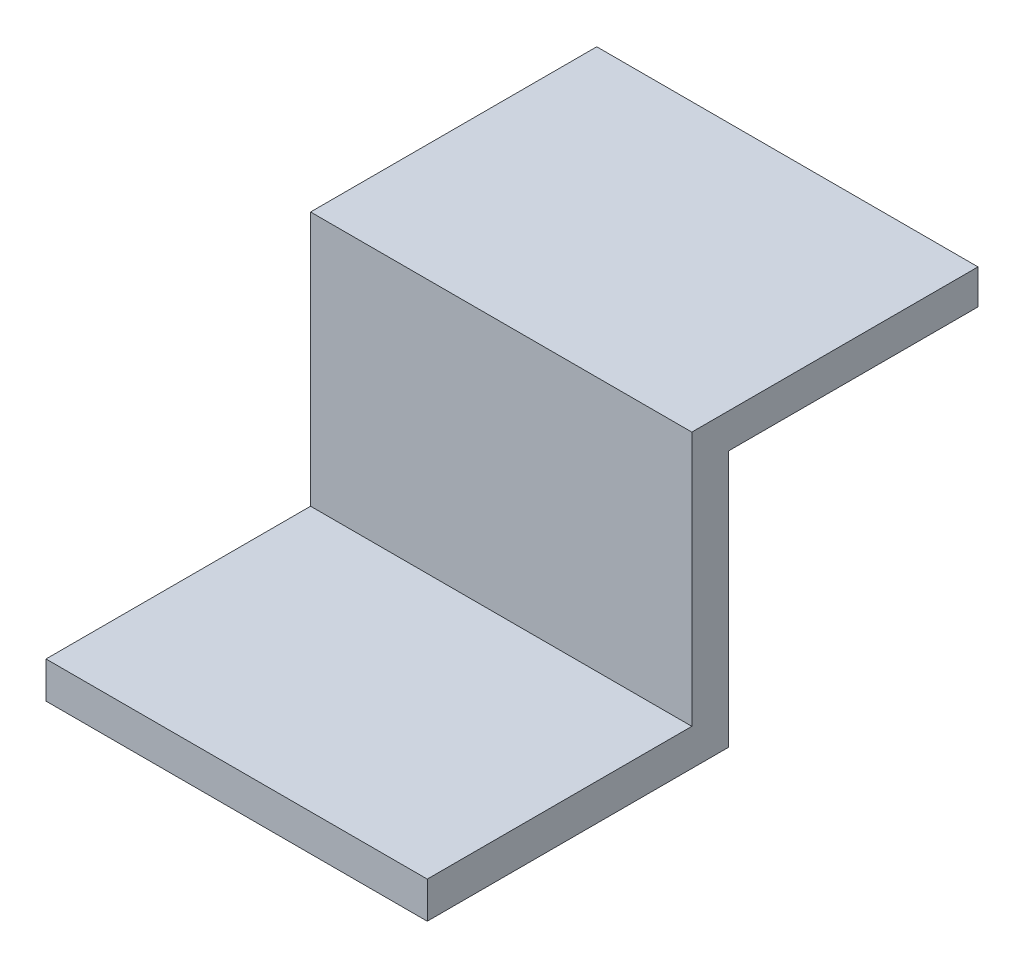
ISO-10303-21;
HEADER;
FILE_DESCRIPTION(('STEP AP214'),'2;1');
FILE_NAME('part.step','',(''),(''),'','','');
FILE_SCHEMA(('AUTOMOTIVE_DESIGN { 1 0 10303 214 1 1 1 1 }'));
ENDSEC;
DATA;
#1=APPLICATION_CONTEXT('core data for automotive mechanical design processes');
#2=APPLICATION_PROTOCOL_DEFINITION('international standard','automotive_design',2000,#1);
#3=PRODUCT_CONTEXT('',#1,'mechanical');
#4=PRODUCT('Part','Part','',(#3));
#5=PRODUCT_RELATED_PRODUCT_CATEGORY('part','',(#4));
#6=PRODUCT_DEFINITION_FORMATION('','',#4);
#7=PRODUCT_DEFINITION_CONTEXT('part definition',#1,'design');
#8=PRODUCT_DEFINITION('design','',#6,#7);
#9=PRODUCT_DEFINITION_SHAPE('','',#8);
#10=(LENGTH_UNIT() NAMED_UNIT(*) SI_UNIT(.MILLI.,.METRE.));
#11=(NAMED_UNIT(*) PLANE_ANGLE_UNIT() SI_UNIT($,.RADIAN.));
#12=(NAMED_UNIT(*) SI_UNIT($,.STERADIAN.) SOLID_ANGLE_UNIT());
#13=UNCERTAINTY_MEASURE_WITH_UNIT(LENGTH_MEASURE(1.E-05),#10,'distance_accuracy_value','');
#14=(GEOMETRIC_REPRESENTATION_CONTEXT(3) GLOBAL_UNCERTAINTY_ASSIGNED_CONTEXT((#13)) GLOBAL_UNIT_ASSIGNED_CONTEXT((#10,
#11,#12)) REPRESENTATION_CONTEXT('',''));
#15=CARTESIAN_POINT('',(0.,0.,0.));
#16=DIRECTION('',(0.,0.,1.));
#17=DIRECTION('',(1.,0.,0.));
#18=AXIS2_PLACEMENT_3D('',#15,#16,#17);
#19=CARTESIAN_POINT('',(-66.294,50.658753448874,-95.7628172012009));
#20=DIRECTION('',(0.,0.,-1.));
#21=DIRECTION('',(-1.,0.,0.));
#22=AXIS2_PLACEMENT_3D('',#19,#20,#21);
#23=PLANE('',#22);
#24=DIRECTION('',(0.,1.,0.));
#25=VECTOR('',#24,1.);
#26=CARTESIAN_POINT('',(0.,50.658753448874,-95.7628172012009));
#27=LINE('',#26,#25);
#28=CARTESIAN_POINT('',(0.,44.6271764040838,-95.7628172012009));
#29=VERTEX_POINT('',#28);
#30=CARTESIAN_POINT('',(0.,50.658753448874,-95.7628172012009));
#31=VERTEX_POINT('',#30);
#32=EDGE_CURVE('E141',#29,#31,#27,.T.);
#33=ORIENTED_EDGE('',*,*,#32,.F.);
#34=DIRECTION('',(1.,0.,0.));
#35=VECTOR('',#34,1.);
#36=CARTESIAN_POINT('',(-66.294,44.6271764040838,-95.7628172012009));
#37=LINE('',#36,#35);
#38=CARTESIAN_POINT('',(-66.294,44.6271764040838,-95.7628172012009));
#39=VERTEX_POINT('',#38);
#40=EDGE_CURVE('E40',#39,#29,#37,.T.);
#41=ORIENTED_EDGE('',*,*,#40,.F.);
#42=DIRECTION('',(0.,1.,0.));
#43=VECTOR('',#42,1.);
#44=CARTESIAN_POINT('',(-66.294,50.658753448874,-95.7628172012009));
#45=LINE('',#44,#43);
#46=CARTESIAN_POINT('',(-66.294,50.658753448874,-95.7628172012009));
#47=VERTEX_POINT('',#46);
#48=EDGE_CURVE('E115',#39,#47,#45,.T.);
#49=ORIENTED_EDGE('',*,*,#48,.T.);
#50=DIRECTION('',(1.,0.,0.));
#51=VECTOR('',#50,1.);
#52=CARTESIAN_POINT('',(-66.294,50.658753448874,-95.7628172012009));
#53=LINE('',#52,#51);
#54=EDGE_CURVE('E11',#47,#31,#53,.T.);
#55=ORIENTED_EDGE('',*,*,#54,.T.);
#56=EDGE_LOOP('',(#33,#41,#49,#55));
#57=FACE_BOUND('',#56,.T.);
#58=ADVANCED_FACE('F30',(#57),#23,.T.);
#59=CARTESIAN_POINT('',(-66.294,44.6271764040838,-52.3533001957925));
#60=DIRECTION('',(0.,-1.,0.));
#61=DIRECTION('',(0.,0.,-1.));
#62=AXIS2_PLACEMENT_3D('',#59,#60,#61);
#63=PLANE('',#62);
#64=DIRECTION('',(0.,0.,-1.));
#65=VECTOR('',#64,1.);
#66=CARTESIAN_POINT('',(0.,44.6271764040838,-52.3533001957925));
#67=LINE('',#66,#65);
#68=CARTESIAN_POINT('',(0.,44.6271764040838,-52.3533001957925));
#69=VERTEX_POINT('',#68);
#70=EDGE_CURVE('E101',#69,#29,#67,.T.);
#71=ORIENTED_EDGE('',*,*,#70,.F.);
#72=DIRECTION('',(1.,0.,0.));
#73=VECTOR('',#72,1.);
#74=CARTESIAN_POINT('',(-66.294,44.6271764040838,-52.3533001957925));
#75=LINE('',#74,#73);
#76=CARTESIAN_POINT('',(-66.294,44.6271764040838,-52.3533001957925));
#77=VERTEX_POINT('',#76);
#78=EDGE_CURVE('E96',#77,#69,#75,.T.);
#79=ORIENTED_EDGE('',*,*,#78,.F.);
#80=DIRECTION('',(0.,0.,-1.));
#81=VECTOR('',#80,1.);
#82=CARTESIAN_POINT('',(-66.294,44.6271764040838,-52.3533001957925));
#83=LINE('',#82,#81);
#84=EDGE_CURVE('E99',#77,#39,#83,.T.);
#85=ORIENTED_EDGE('',*,*,#84,.T.);
#86=ORIENTED_EDGE('',*,*,#40,.T.);
#87=EDGE_LOOP('',(#71,#79,#85,#86));
#88=FACE_BOUND('',#87,.T.);
#89=ADVANCED_FACE('F98',(#88),#63,.T.);
#90=CARTESIAN_POINT('',(-66.294,44.6271764040838,-52.3533001957925));
#91=DIRECTION('',(0.,0.,-1.));
#92=DIRECTION('',(0.,1.,0.));
#93=AXIS2_PLACEMENT_3D('',#90,#91,#92);
#94=PLANE('',#93);
#95=DIRECTION('',(0.,1.,0.));
#96=VECTOR('',#95,1.);
#97=CARTESIAN_POINT('',(0.,44.6271764040838,-52.3533001957925));
#98=LINE('',#97,#96);
#99=CARTESIAN_POINT('',(0.,0.,-52.3533001957925));
#100=VERTEX_POINT('',#99);
#101=EDGE_CURVE('E138',#100,#69,#98,.T.);
#102=ORIENTED_EDGE('',*,*,#101,.F.);
#103=DIRECTION('',(1.,0.,0.));
#104=VECTOR('',#103,1.);
#105=CARTESIAN_POINT('',(-66.294,0.,-52.3533001957925));
#106=LINE('',#105,#104);
#107=CARTESIAN_POINT('',(-66.294,0.,-52.3533001957925));
#108=VERTEX_POINT('',#107);
#109=EDGE_CURVE('E106',#108,#100,#106,.T.);
#110=ORIENTED_EDGE('',*,*,#109,.F.);
#111=DIRECTION('',(0.,1.,0.));
#112=VECTOR('',#111,1.);
#113=CARTESIAN_POINT('',(-66.294,44.6271764040838,-52.3533001957925));
#114=LINE('',#113,#112);
#115=EDGE_CURVE('E112',#108,#77,#114,.T.);
#116=ORIENTED_EDGE('',*,*,#115,.T.);
#117=ORIENTED_EDGE('',*,*,#78,.T.);
#118=EDGE_LOOP('',(#102,#110,#116,#117));
#119=FACE_BOUND('',#118,.T.);
#120=ADVANCED_FACE('F117',(#119),#94,.T.);
#121=CARTESIAN_POINT('',(-66.294,0.,-52.3533001957925));
#122=DIRECTION('',(0.,-1.,0.));
#123=DIRECTION('',(0.,0.,-1.));
#124=AXIS2_PLACEMENT_3D('',#121,#122,#123);
#125=PLANE('',#124);
#126=DIRECTION('',(0.,0.,-1.));
#127=VECTOR('',#126,1.);
#128=CARTESIAN_POINT('',(0.,0.,-52.3533001957925));
#129=LINE('',#128,#127);
#130=CARTESIAN_POINT('',(0.,0.,0.));
#131=VERTEX_POINT('',#130);
#132=EDGE_CURVE('E135',#131,#100,#129,.T.);
#133=ORIENTED_EDGE('',*,*,#132,.F.);
#134=DIRECTION('',(1.,0.,0.));
#135=VECTOR('',#134,1.);
#136=CARTESIAN_POINT('',(-66.294,0.,0.));
#137=LINE('',#136,#135);
#138=CARTESIAN_POINT('',(-66.294,0.,0.));
#139=VERTEX_POINT('',#138);
#140=EDGE_CURVE('E146',#139,#131,#137,.T.);
#141=ORIENTED_EDGE('',*,*,#140,.F.);
#142=DIRECTION('',(0.,0.,-1.));
#143=VECTOR('',#142,1.);
#144=CARTESIAN_POINT('',(-66.294,0.,-52.3533001957925));
#145=LINE('',#144,#143);
#146=EDGE_CURVE('E118',#139,#108,#145,.T.);
#147=ORIENTED_EDGE('',*,*,#146,.T.);
#148=ORIENTED_EDGE('',*,*,#109,.T.);
#149=EDGE_LOOP('',(#133,#141,#147,#148));
#150=FACE_BOUND('',#149,.T.);
#151=ADVANCED_FACE('F171',(#150),#125,.T.);
#152=CARTESIAN_POINT('',(-66.294,0.,0.));
#153=DIRECTION('',(0.,0.,1.));
#154=DIRECTION('',(1.,0.,0.));
#155=AXIS2_PLACEMENT_3D('',#152,#153,#154);
#156=PLANE('',#155);
#157=DIRECTION('',(0.,-1.,0.));
#158=VECTOR('',#157,1.);
#159=CARTESIAN_POINT('',(0.,0.,0.));
#160=LINE('',#159,#158);
#161=CARTESIAN_POINT('',(0.,6.35,0.));
#162=VERTEX_POINT('',#161);
#163=EDGE_CURVE('E132',#162,#131,#160,.T.);
#164=ORIENTED_EDGE('',*,*,#163,.F.);
#165=DIRECTION('',(1.,0.,0.));
#166=VECTOR('',#165,1.);
#167=CARTESIAN_POINT('',(-66.294,6.35,0.));
#168=LINE('',#167,#166);
#169=CARTESIAN_POINT('',(-66.294,6.35,0.));
#170=VERTEX_POINT('',#169);
#171=EDGE_CURVE('E148',#170,#162,#168,.T.);
#172=ORIENTED_EDGE('',*,*,#171,.F.);
#173=DIRECTION('',(0.,-1.,0.));
#174=VECTOR('',#173,1.);
#175=CARTESIAN_POINT('',(-66.294,0.,0.));
#176=LINE('',#175,#174);
#177=EDGE_CURVE('E120',#170,#139,#176,.T.);
#178=ORIENTED_EDGE('',*,*,#177,.T.);
#179=ORIENTED_EDGE('',*,*,#140,.T.);
#180=EDGE_LOOP('',(#164,#172,#178,#179));
#181=FACE_BOUND('',#180,.T.);
#182=ADVANCED_FACE('F174',(#181),#156,.T.);
#183=CARTESIAN_POINT('',(-66.294,6.35,0.));
#184=DIRECTION('',(0.,1.,0.));
#185=DIRECTION('',(0.,0.,1.));
#186=AXIS2_PLACEMENT_3D('',#183,#184,#185);
#187=PLANE('',#186);
#188=DIRECTION('',(0.,0.,1.));
#189=VECTOR('',#188,1.);
#190=CARTESIAN_POINT('',(0.,6.35,0.));
#191=LINE('',#190,#189);
#192=CARTESIAN_POINT('',(0.,6.35,-46.0033001957925));
#193=VERTEX_POINT('',#192);
#194=EDGE_CURVE('E129',#193,#162,#191,.T.);
#195=ORIENTED_EDGE('',*,*,#194,.F.);
#196=DIRECTION('',(1.,0.,0.));
#197=VECTOR('',#196,1.);
#198=CARTESIAN_POINT('',(-66.294,6.35,-46.0033001957925));
#199=LINE('',#198,#197);
#200=CARTESIAN_POINT('',(-66.294,6.35,-46.0033001957925));
#201=VERTEX_POINT('',#200);
#202=EDGE_CURVE('E149',#201,#193,#199,.T.);
#203=ORIENTED_EDGE('',*,*,#202,.F.);
#204=DIRECTION('',(0.,0.,1.));
#205=VECTOR('',#204,1.);
#206=CARTESIAN_POINT('',(-66.294,6.35,0.));
#207=LINE('',#206,#205);
#208=EDGE_CURVE('E253',#201,#170,#207,.T.);
#209=ORIENTED_EDGE('',*,*,#208,.T.);
#210=ORIENTED_EDGE('',*,*,#171,.T.);
#211=EDGE_LOOP('',(#195,#203,#209,#210));
#212=FACE_BOUND('',#211,.T.);
#213=ADVANCED_FACE('F178',(#212),#187,.T.);
#214=CARTESIAN_POINT('',(-66.294,6.35,-46.0033001957925));
#215=DIRECTION('',(0.,0.,1.));
#216=DIRECTION('',(1.,0.,0.));
#217=AXIS2_PLACEMENT_3D('',#214,#215,#216);
#218=PLANE('',#217);
#219=DIRECTION('',(0.,-1.,0.));
#220=VECTOR('',#219,1.);
#221=CARTESIAN_POINT('',(0.,6.35,-46.0033001957925));
#222=LINE('',#221,#220);
#223=CARTESIAN_POINT('',(0.,50.658753448874,-46.0033001957925));
#224=VERTEX_POINT('',#223);
#225=EDGE_CURVE('E126',#224,#193,#222,.T.);
#226=ORIENTED_EDGE('',*,*,#225,.F.);
#227=DIRECTION('',(1.,0.,0.));
#228=VECTOR('',#227,1.);
#229=CARTESIAN_POINT('',(-66.294,50.658753448874,-46.0033001957925));
#230=LINE('',#229,#228);
#231=CARTESIAN_POINT('',(-66.294,50.658753448874,-46.0033001957925));
#232=VERTEX_POINT('',#231);
#233=EDGE_CURVE('E34',#232,#224,#230,.T.);
#234=ORIENTED_EDGE('',*,*,#233,.F.);
#235=DIRECTION('',(0.,-1.,0.));
#236=VECTOR('',#235,1.);
#237=CARTESIAN_POINT('',(-66.294,6.35,-46.0033001957925));
#238=LINE('',#237,#236);
#239=EDGE_CURVE('E254',#232,#201,#238,.T.);
#240=ORIENTED_EDGE('',*,*,#239,.T.);
#241=ORIENTED_EDGE('',*,*,#202,.T.);
#242=EDGE_LOOP('',(#226,#234,#240,#241));
#243=FACE_BOUND('',#242,.T.);
#244=ADVANCED_FACE('F155',(#243),#218,.T.);
#245=CARTESIAN_POINT('',(-66.294,50.658753448874,-46.0033001957925));
#246=DIRECTION('',(0.,1.,0.));
#247=DIRECTION('',(0.,0.,1.));
#248=AXIS2_PLACEMENT_3D('',#245,#246,#247);
#249=PLANE('',#248);
#250=DIRECTION('',(0.,0.,1.));
#251=VECTOR('',#250,1.);
#252=CARTESIAN_POINT('',(0.,50.658753448874,-46.0033001957925));
#253=LINE('',#252,#251);
#254=EDGE_CURVE('E79',#31,#224,#253,.T.);
#255=ORIENTED_EDGE('',*,*,#254,.F.);
#256=ORIENTED_EDGE('',*,*,#54,.F.);
#257=DIRECTION('',(0.,0.,1.));
#258=VECTOR('',#257,1.);
#259=CARTESIAN_POINT('',(-66.294,50.658753448874,-52.3533001957925));
#260=LINE('',#259,#258);
#261=EDGE_CURVE('E82',#47,#232,#260,.T.);
#262=ORIENTED_EDGE('',*,*,#261,.T.);
#263=ORIENTED_EDGE('',*,*,#233,.T.);
#264=EDGE_LOOP('',(#255,#256,#262,#263));
#265=FACE_BOUND('',#264,.T.);
#266=ADVANCED_FACE('F32',(#265),#249,.T.);
#267=CARTESIAN_POINT('',(-66.294,50.658753448874,-95.7628172012009));
#268=DIRECTION('',(-1.,0.,0.));
#269=DIRECTION('',(0.,0.,1.));
#270=AXIS2_PLACEMENT_3D('',#267,#268,#269);
#271=PLANE('',#270);
#272=ORIENTED_EDGE('',*,*,#261,.F.);
#273=ORIENTED_EDGE('',*,*,#48,.F.);
#274=ORIENTED_EDGE('',*,*,#84,.F.);
#275=ORIENTED_EDGE('',*,*,#115,.F.);
#276=ORIENTED_EDGE('',*,*,#146,.F.);
#277=ORIENTED_EDGE('',*,*,#177,.F.);
#278=ORIENTED_EDGE('',*,*,#208,.F.);
#279=ORIENTED_EDGE('',*,*,#239,.F.);
#280=EDGE_LOOP('',(#272,#273,#274,#275,#276,#277,#278,#279));
#281=FACE_BOUND('',#280,.T.);
#282=ADVANCED_FACE('F110',(#281),#271,.T.);
#283=CARTESIAN_POINT('',(0.,50.658753448874,-95.7628172012009));
#284=DIRECTION('',(-1.,0.,0.));
#285=DIRECTION('',(0.,0.,1.));
#286=AXIS2_PLACEMENT_3D('',#283,#284,#285);
#287=PLANE('',#286);
#288=ORIENTED_EDGE('',*,*,#32,.T.);
#289=ORIENTED_EDGE('',*,*,#254,.T.);
#290=ORIENTED_EDGE('',*,*,#225,.T.);
#291=ORIENTED_EDGE('',*,*,#194,.T.);
#292=ORIENTED_EDGE('',*,*,#163,.T.);
#293=ORIENTED_EDGE('',*,*,#132,.T.);
#294=ORIENTED_EDGE('',*,*,#101,.T.);
#295=ORIENTED_EDGE('',*,*,#70,.T.);
#296=EDGE_LOOP('',(#288,#289,#290,#291,#292,#293,#294,#295));
#297=FACE_BOUND('',#296,.T.);
#298=ADVANCED_FACE('F157',(#297),#287,.F.);
#299=CLOSED_SHELL('',(#58,#89,#120,#151,#182,#213,#244,#266,#282,#298));
#300=MANIFOLD_SOLID_BREP('B2',#299);
#301=ADVANCED_BREP_SHAPE_REPRESENTATION('',(#18,#300),#14);
#302=SHAPE_DEFINITION_REPRESENTATION(#9,#301);
ENDSEC;
END-ISO-10303-21;
